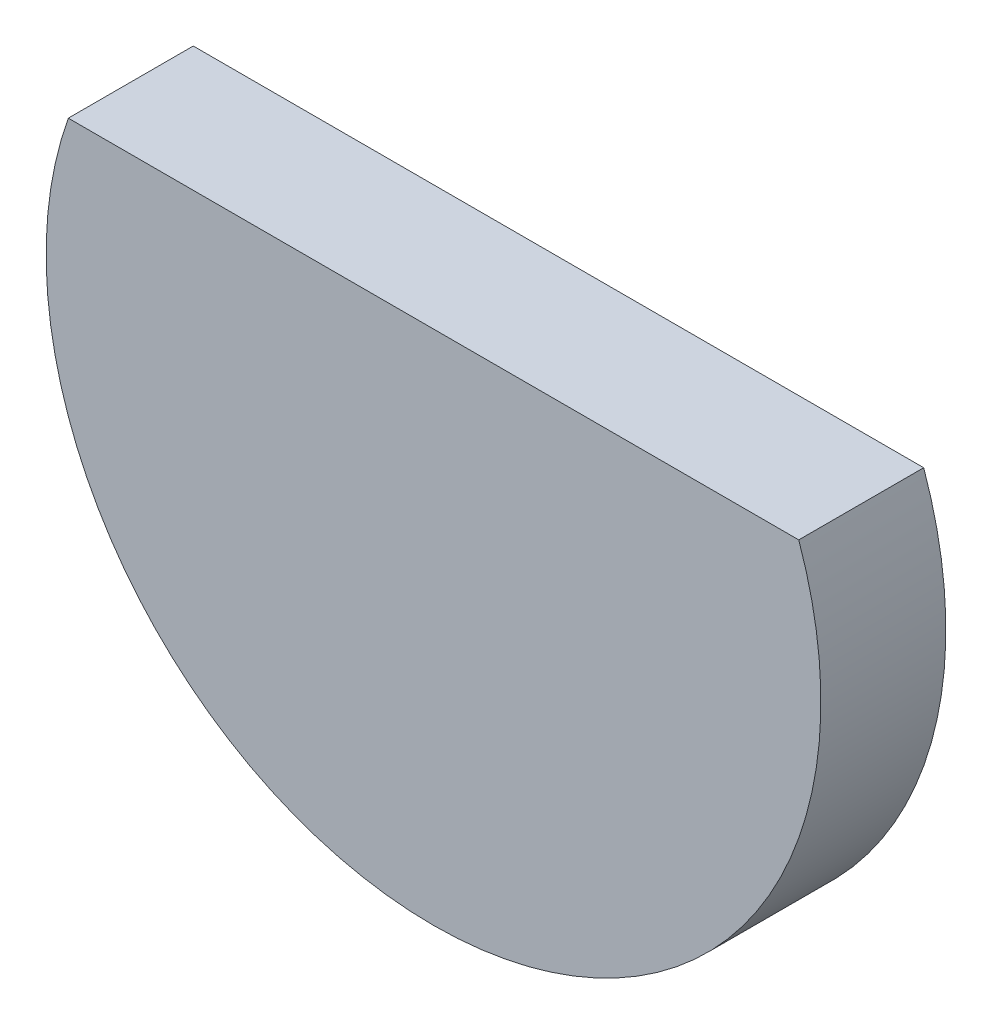
ISO-10303-21;
HEADER;
FILE_DESCRIPTION(('STEP AP214'),'2;1');
FILE_NAME('part.step','',(''),(''),'','','');
FILE_SCHEMA(('AUTOMOTIVE_DESIGN { 1 0 10303 214 1 1 1 1 }'));
ENDSEC;
DATA;
#1=APPLICATION_CONTEXT('core data for automotive mechanical design processes');
#2=APPLICATION_PROTOCOL_DEFINITION('international standard','automotive_design',2000,#1);
#3=PRODUCT_CONTEXT('',#1,'mechanical');
#4=PRODUCT('Part','Part','',(#3));
#5=PRODUCT_RELATED_PRODUCT_CATEGORY('part','',(#4));
#6=PRODUCT_DEFINITION_FORMATION('','',#4);
#7=PRODUCT_DEFINITION_CONTEXT('part definition',#1,'design');
#8=PRODUCT_DEFINITION('design','',#6,#7);
#9=PRODUCT_DEFINITION_SHAPE('','',#8);
#10=(LENGTH_UNIT() NAMED_UNIT(*) SI_UNIT(.MILLI.,.METRE.));
#11=(NAMED_UNIT(*) PLANE_ANGLE_UNIT() SI_UNIT($,.RADIAN.));
#12=(NAMED_UNIT(*) SI_UNIT($,.STERADIAN.) SOLID_ANGLE_UNIT());
#13=UNCERTAINTY_MEASURE_WITH_UNIT(LENGTH_MEASURE(1.E-05),#10,'distance_accuracy_value','');
#14=(GEOMETRIC_REPRESENTATION_CONTEXT(3) GLOBAL_UNCERTAINTY_ASSIGNED_CONTEXT((#13)) GLOBAL_UNIT_ASSIGNED_CONTEXT((#10,
#11,#12)) REPRESENTATION_CONTEXT('',''));
#15=CARTESIAN_POINT('',(0.,0.,0.));
#16=DIRECTION('',(0.,0.,1.));
#17=DIRECTION('',(1.,0.,0.));
#18=AXIS2_PLACEMENT_3D('',#15,#16,#17);
#19=CARTESIAN_POINT('',(0.,0.,4.));
#20=DIRECTION('',(0.,0.,-1.));
#21=DIRECTION('',(-1.,0.,0.));
#22=AXIS2_PLACEMENT_3D('',#19,#20,#21);
#23=CYLINDRICAL_SURFACE('',#22,12.4);
#24=CARTESIAN_POINT('',(0.,0.,4.));
#25=DIRECTION('',(0.,0.,1.));
#26=DIRECTION('',(1.,0.,0.));
#27=AXIS2_PLACEMENT_3D('',#24,#25,#26);
#28=CIRCLE('',#27,12.4);
#29=CARTESIAN_POINT('',(-11.6908321156176,4.13333333333334,4.));
#30=VERTEX_POINT('',#29);
#31=CARTESIAN_POINT('',(11.6908321156176,4.13333333333334,4.));
#32=VERTEX_POINT('',#31);
#33=EDGE_CURVE('E11',#30,#32,#28,.T.);
#34=ORIENTED_EDGE('',*,*,#33,.F.);
#35=DIRECTION('',(0.,0.,1.));
#36=VECTOR('',#35,1.);
#37=CARTESIAN_POINT('',(-11.6908321156176,4.13333333333334,0.));
#38=LINE('',#37,#36);
#39=CARTESIAN_POINT('',(-11.6908321156176,4.13333333333334,0.));
#40=VERTEX_POINT('',#39);
#41=EDGE_CURVE('E56',#40,#30,#38,.T.);
#42=ORIENTED_EDGE('',*,*,#41,.F.);
#43=CARTESIAN_POINT('',(0.,0.,0.));
#44=DIRECTION('',(0.,0.,1.));
#45=DIRECTION('',(1.,0.,0.));
#46=AXIS2_PLACEMENT_3D('',#43,#44,#45);
#47=CIRCLE('',#46,12.4);
#48=CARTESIAN_POINT('',(11.6908321156176,4.13333333333334,0.));
#49=VERTEX_POINT('',#48);
#50=EDGE_CURVE('E36',#40,#49,#47,.T.);
#51=ORIENTED_EDGE('',*,*,#50,.T.);
#52=DIRECTION('',(0.,0.,1.));
#53=VECTOR('',#52,1.);
#54=CARTESIAN_POINT('',(11.6908321156176,4.13333333333334,0.));
#55=LINE('',#54,#53);
#56=EDGE_CURVE('E47',#49,#32,#55,.T.);
#57=ORIENTED_EDGE('',*,*,#56,.T.);
#58=EDGE_LOOP('',(#34,#42,#51,#57));
#59=FACE_BOUND('',#58,.T.);
#60=ADVANCED_FACE('F33',(#59),#23,.T.);
#61=CARTESIAN_POINT('',(0.,0.,4.));
#62=DIRECTION('',(0.,0.,1.));
#63=DIRECTION('',(1.,0.,0.));
#64=AXIS2_PLACEMENT_3D('',#61,#62,#63);
#65=PLANE('',#64);
#66=DIRECTION('',(1.,0.,0.));
#67=VECTOR('',#66,1.);
#68=CARTESIAN_POINT('',(-11.6908321156176,4.13333333333334,4.));
#69=LINE('',#68,#67);
#70=EDGE_CURVE('E59',#30,#32,#69,.T.);
#71=ORIENTED_EDGE('',*,*,#70,.F.);
#72=ORIENTED_EDGE('',*,*,#33,.T.);
#73=EDGE_LOOP('',(#71,#72));
#74=FACE_BOUND('',#73,.T.);
#75=ADVANCED_FACE('F66',(#74),#65,.T.);
#76=CARTESIAN_POINT('',(0.,0.,0.));
#77=DIRECTION('',(0.,0.,1.));
#78=DIRECTION('',(1.,0.,0.));
#79=AXIS2_PLACEMENT_3D('',#76,#77,#78);
#80=PLANE('',#79);
#81=ORIENTED_EDGE('',*,*,#50,.F.);
#82=DIRECTION('',(1.,0.,0.));
#83=VECTOR('',#82,1.);
#84=CARTESIAN_POINT('',(-11.6908321156176,4.13333333333334,0.));
#85=LINE('',#84,#83);
#86=EDGE_CURVE('E52',#40,#49,#85,.T.);
#87=ORIENTED_EDGE('',*,*,#86,.T.);
#88=EDGE_LOOP('',(#81,#87));
#89=FACE_BOUND('',#88,.T.);
#90=ADVANCED_FACE('F71',(#89),#80,.F.);
#91=CARTESIAN_POINT('',(-11.6908321156176,4.13333333333334,0.));
#92=DIRECTION('',(0.,-1.,0.));
#93=DIRECTION('',(0.,0.,-1.));
#94=AXIS2_PLACEMENT_3D('',#91,#92,#93);
#95=PLANE('',#94);
#96=ORIENTED_EDGE('',*,*,#70,.T.);
#97=ORIENTED_EDGE('',*,*,#56,.F.);
#98=ORIENTED_EDGE('',*,*,#86,.F.);
#99=ORIENTED_EDGE('',*,*,#41,.T.);
#100=EDGE_LOOP('',(#96,#97,#98,#99));
#101=FACE_BOUND('',#100,.T.);
#102=ADVANCED_FACE('F58',(#101),#95,.F.);
#103=CLOSED_SHELL('',(#60,#75,#90,#102));
#104=MANIFOLD_SOLID_BREP('B2',#103);
#105=ADVANCED_BREP_SHAPE_REPRESENTATION('',(#18,#104),#14);
#106=SHAPE_DEFINITION_REPRESENTATION(#9,#105);
ENDSEC;
END-ISO-10303-21;
